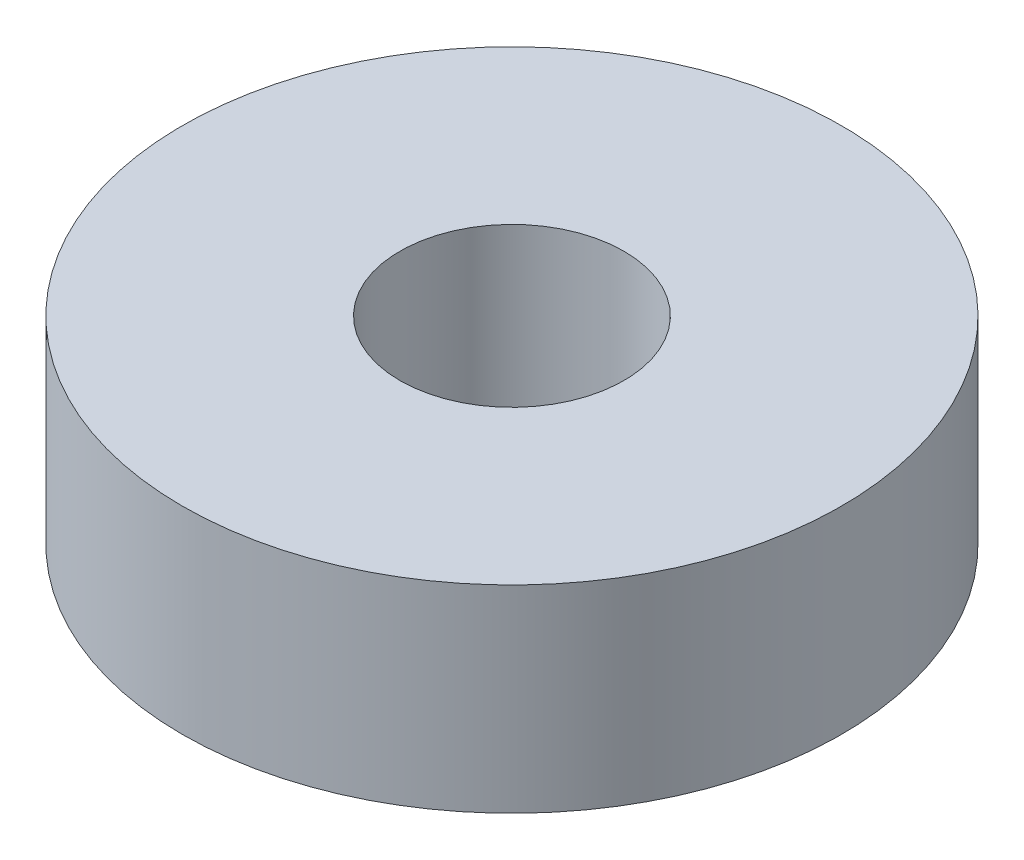
ISO-10303-21;
HEADER;
FILE_DESCRIPTION(('STEP AP214'),'2;1');
FILE_NAME('part.step','',(''),(''),'','','');
FILE_SCHEMA(('AUTOMOTIVE_DESIGN { 1 0 10303 214 1 1 1 1 }'));
ENDSEC;
DATA;
#1=APPLICATION_CONTEXT('core data for automotive mechanical design processes');
#2=APPLICATION_PROTOCOL_DEFINITION('international standard','automotive_design',2000,#1);
#3=PRODUCT_CONTEXT('',#1,'mechanical');
#4=PRODUCT('Part','Part','',(#3));
#5=PRODUCT_RELATED_PRODUCT_CATEGORY('part','',(#4));
#6=PRODUCT_DEFINITION_FORMATION('','',#4);
#7=PRODUCT_DEFINITION_CONTEXT('part definition',#1,'design');
#8=PRODUCT_DEFINITION('design','',#6,#7);
#9=PRODUCT_DEFINITION_SHAPE('','',#8);
#10=(LENGTH_UNIT() NAMED_UNIT(*) SI_UNIT(.MILLI.,.METRE.));
#11=(NAMED_UNIT(*) PLANE_ANGLE_UNIT() SI_UNIT($,.RADIAN.));
#12=(NAMED_UNIT(*) SI_UNIT($,.STERADIAN.) SOLID_ANGLE_UNIT());
#13=UNCERTAINTY_MEASURE_WITH_UNIT(LENGTH_MEASURE(1.E-05),#10,'distance_accuracy_value','');
#14=(GEOMETRIC_REPRESENTATION_CONTEXT(3) GLOBAL_UNCERTAINTY_ASSIGNED_CONTEXT((#13)) GLOBAL_UNIT_ASSIGNED_CONTEXT((#10,
#11,#12)) REPRESENTATION_CONTEXT('',''));
#15=CARTESIAN_POINT('',(0.,0.,0.));
#16=DIRECTION('',(0.,0.,1.));
#17=DIRECTION('',(1.,0.,0.));
#18=AXIS2_PLACEMENT_3D('',#15,#16,#17);
#19=CARTESIAN_POINT('',(0.,1.5,0.));
#20=DIRECTION('',(0.,-1.,0.));
#21=DIRECTION('',(0.,0.,-1.));
#22=AXIS2_PLACEMENT_3D('',#19,#20,#21);
#23=CYLINDRICAL_SURFACE('',#22,2.5);
#24=CARTESIAN_POINT('',(0.,1.5,0.));
#25=DIRECTION('',(0.,1.,0.));
#26=DIRECTION('',(0.,0.,1.));
#27=AXIS2_PLACEMENT_3D('',#24,#25,#26);
#28=CIRCLE('',#27,2.5);
#29=CARTESIAN_POINT('',(0.,1.5,2.5));
#30=VERTEX_POINT('',#29);
#31=EDGE_CURVE('E10',#30,#30,#28,.T.);
#32=ORIENTED_EDGE('',*,*,#31,.F.);
#33=EDGE_LOOP('',(#32));
#34=FACE_BOUND('',#33,.T.);
#35=CARTESIAN_POINT('',(0.,0.,0.));
#36=DIRECTION('',(0.,1.,0.));
#37=DIRECTION('',(0.,0.,1.));
#38=AXIS2_PLACEMENT_3D('',#35,#36,#37);
#39=CIRCLE('',#38,2.5);
#40=CARTESIAN_POINT('',(0.,0.,2.5));
#41=VERTEX_POINT('',#40);
#42=EDGE_CURVE('E36',#41,#41,#39,.T.);
#43=ORIENTED_EDGE('',*,*,#42,.T.);
#44=EDGE_LOOP('',(#43));
#45=FACE_BOUND('',#44,.T.);
#46=ADVANCED_FACE('F33',(#34,#45),#23,.T.);
#47=CARTESIAN_POINT('',(0.,1.5,0.));
#48=DIRECTION('',(0.,1.,0.));
#49=DIRECTION('',(0.,0.,1.));
#50=AXIS2_PLACEMENT_3D('',#47,#48,#49);
#51=PLANE('',#50);
#52=CARTESIAN_POINT('',(0.,1.5,0.));
#53=DIRECTION('',(0.,1.,0.));
#54=DIRECTION('',(0.,0.,1.));
#55=AXIS2_PLACEMENT_3D('',#52,#53,#54);
#56=CIRCLE('',#55,0.85);
#57=CARTESIAN_POINT('',(0.,1.5,0.85));
#58=VERTEX_POINT('',#57);
#59=EDGE_CURVE('E45',#58,#58,#56,.T.);
#60=ORIENTED_EDGE('',*,*,#59,.F.);
#61=EDGE_LOOP('',(#60));
#62=FACE_BOUND('',#61,.T.);
#63=ORIENTED_EDGE('',*,*,#31,.T.);
#64=EDGE_LOOP('',(#63));
#65=FACE_BOUND('',#64,.T.);
#66=ADVANCED_FACE('F60',(#62,#65),#51,.T.);
#67=CARTESIAN_POINT('',(0.,0.,0.));
#68=DIRECTION('',(0.,1.,0.));
#69=DIRECTION('',(0.,0.,1.));
#70=AXIS2_PLACEMENT_3D('',#67,#68,#69);
#71=PLANE('',#70);
#72=CARTESIAN_POINT('',(0.,0.,0.));
#73=DIRECTION('',(0.,1.,0.));
#74=DIRECTION('',(0.,0.,1.));
#75=AXIS2_PLACEMENT_3D('',#72,#73,#74);
#76=CIRCLE('',#75,0.85);
#77=CARTESIAN_POINT('',(0.,0.,0.85));
#78=VERTEX_POINT('',#77);
#79=EDGE_CURVE('E43',#78,#78,#76,.T.);
#80=ORIENTED_EDGE('',*,*,#79,.T.);
#81=EDGE_LOOP('',(#80));
#82=FACE_BOUND('',#81,.T.);
#83=ORIENTED_EDGE('',*,*,#42,.F.);
#84=EDGE_LOOP('',(#83));
#85=FACE_BOUND('',#84,.T.);
#86=ADVANCED_FACE('F51',(#82,#85),#71,.F.);
#87=CARTESIAN_POINT('',(0.,0.,0.));
#88=DIRECTION('',(0.,1.,0.));
#89=DIRECTION('',(0.,0.,1.));
#90=AXIS2_PLACEMENT_3D('',#87,#88,#89);
#91=CYLINDRICAL_SURFACE('',#90,0.85);
#92=ORIENTED_EDGE('',*,*,#79,.F.);
#93=EDGE_LOOP('',(#92));
#94=FACE_BOUND('',#93,.T.);
#95=ORIENTED_EDGE('',*,*,#59,.T.);
#96=EDGE_LOOP('',(#95));
#97=FACE_BOUND('',#96,.T.);
#98=ADVANCED_FACE('F54',(#94,#97),#91,.F.);
#99=CLOSED_SHELL('',(#46,#66,#86,#98));
#100=MANIFOLD_SOLID_BREP('B2',#99);
#101=ADVANCED_BREP_SHAPE_REPRESENTATION('',(#18,#100),#14);
#102=SHAPE_DEFINITION_REPRESENTATION(#9,#101);
ENDSEC;
END-ISO-10303-21;
